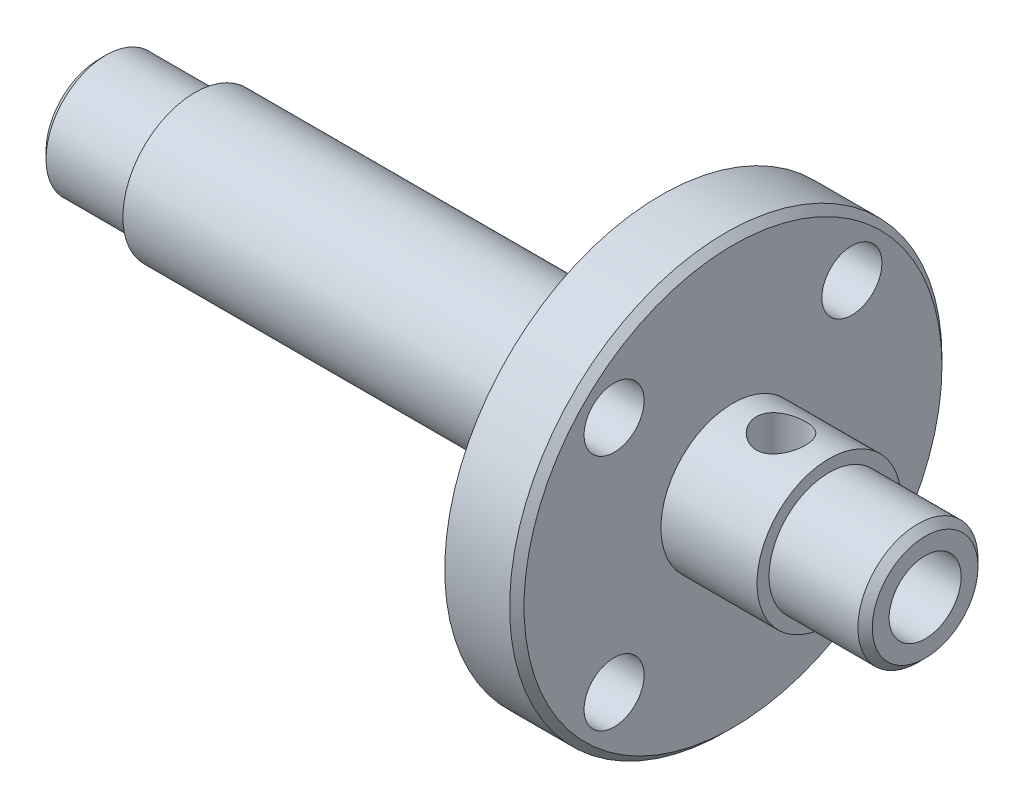
ISO-10303-21;
HEADER;
FILE_DESCRIPTION(('STEP AP214'),'2;1');
FILE_NAME('part.step','',(''),(''),'','','');
FILE_SCHEMA(('AUTOMOTIVE_DESIGN { 1 0 10303 214 1 1 1 1 }'));
ENDSEC;
DATA;
#1=APPLICATION_CONTEXT('core data for automotive mechanical design processes');
#2=APPLICATION_PROTOCOL_DEFINITION('international standard','automotive_design',2000,#1);
#3=PRODUCT_CONTEXT('',#1,'mechanical');
#4=PRODUCT('Part','Part','',(#3));
#5=PRODUCT_RELATED_PRODUCT_CATEGORY('part','',(#4));
#6=PRODUCT_DEFINITION_FORMATION('','',#4);
#7=PRODUCT_DEFINITION_CONTEXT('part definition',#1,'design');
#8=PRODUCT_DEFINITION('design','',#6,#7);
#9=PRODUCT_DEFINITION_SHAPE('','',#8);
#10=(LENGTH_UNIT() NAMED_UNIT(*) SI_UNIT(.MILLI.,.METRE.));
#11=(NAMED_UNIT(*) PLANE_ANGLE_UNIT() SI_UNIT($,.RADIAN.));
#12=(NAMED_UNIT(*) SI_UNIT($,.STERADIAN.) SOLID_ANGLE_UNIT());
#13=UNCERTAINTY_MEASURE_WITH_UNIT(LENGTH_MEASURE(1.E-05),#10,'distance_accuracy_value','');
#14=(GEOMETRIC_REPRESENTATION_CONTEXT(3) GLOBAL_UNCERTAINTY_ASSIGNED_CONTEXT((#13)) GLOBAL_UNIT_ASSIGNED_CONTEXT((#10,
#11,#12)) REPRESENTATION_CONTEXT('',''));
#15=CARTESIAN_POINT('',(0.,0.,0.));
#16=DIRECTION('',(0.,0.,1.));
#17=DIRECTION('',(1.,0.,0.));
#18=AXIS2_PLACEMENT_3D('',#15,#16,#17);
#19=CARTESIAN_POINT('',(0.,0.,0.));
#20=DIRECTION('',(-1.,0.,0.));
#21=DIRECTION('',(0.,0.,1.));
#22=AXIS2_PLACEMENT_3D('',#19,#20,#21);
#23=PLANE('',#22);
#24=CARTESIAN_POINT('',(0.,0.,0.));
#25=DIRECTION('',(-1.,0.,0.));
#26=DIRECTION('',(0.,0.,1.));
#27=AXIS2_PLACEMENT_3D('',#24,#25,#26);
#28=CIRCLE('',#27,2.19999999999999);
#29=CARTESIAN_POINT('',(0.,0.,2.19999999999999));
#30=VERTEX_POINT('',#29);
#31=EDGE_CURVE('E188',#30,#30,#28,.T.);
#32=ORIENTED_EDGE('',*,*,#31,.T.);
#33=EDGE_LOOP('',(#32));
#34=FACE_BOUND('',#33,.T.);
#35=ADVANCED_FACE('F38',(#34),#23,.T.);
#36=CARTESIAN_POINT('',(34.4,0.,0.));
#37=DIRECTION('',(1.,0.,0.));
#38=DIRECTION('',(0.,0.,-1.));
#39=AXIS2_PLACEMENT_3D('',#36,#37,#38);
#40=CYLINDRICAL_SURFACE('',#39,2.49999999999999);
#41=CARTESIAN_POINT('',(0.300000000000009,0.,0.));
#42=DIRECTION('',(-1.,0.,0.));
#43=DIRECTION('',(0.,0.,1.));
#44=AXIS2_PLACEMENT_3D('',#41,#42,#43);
#45=CIRCLE('',#44,2.49999999999999);
#46=CARTESIAN_POINT('',(0.300000000000009,0.,2.49999999999999));
#47=VERTEX_POINT('',#46);
#48=EDGE_CURVE('E191',#47,#47,#45,.F.);
#49=ORIENTED_EDGE('',*,*,#48,.T.);
#50=EDGE_LOOP('',(#49));
#51=FACE_BOUND('',#50,.T.);
#52=CARTESIAN_POINT('',(4.,0.,0.));
#53=DIRECTION('',(1.,0.,0.));
#54=DIRECTION('',(0.,0.,-1.));
#55=AXIS2_PLACEMENT_3D('',#52,#53,#54);
#56=CIRCLE('',#55,2.49999999999999);
#57=CARTESIAN_POINT('',(4.,0.,-2.49999999999999));
#58=VERTEX_POINT('',#57);
#59=EDGE_CURVE('E110',#58,#58,#56,.T.);
#60=ORIENTED_EDGE('',*,*,#59,.F.);
#61=EDGE_LOOP('',(#60));
#62=FACE_BOUND('',#61,.T.);
#63=ADVANCED_FACE('F165',(#51,#62),#40,.T.);
#64=CARTESIAN_POINT('',(4.,2.49999999999999,0.));
#65=DIRECTION('',(-1.,0.,0.));
#66=DIRECTION('',(0.,0.,1.));
#67=AXIS2_PLACEMENT_3D('',#64,#65,#66);
#68=PLANE('',#67);
#69=ORIENTED_EDGE('',*,*,#59,.T.);
#70=EDGE_LOOP('',(#69));
#71=FACE_BOUND('',#70,.T.);
#72=CARTESIAN_POINT('',(4.,0.,0.));
#73=DIRECTION('',(1.,0.,0.));
#74=DIRECTION('',(0.,0.,-1.));
#75=AXIS2_PLACEMENT_3D('',#72,#73,#74);
#76=CIRCLE('',#75,2.99999999999999);
#77=CARTESIAN_POINT('',(4.,0.,-2.99999999999999));
#78=VERTEX_POINT('',#77);
#79=EDGE_CURVE('E107',#78,#78,#76,.T.);
#80=ORIENTED_EDGE('',*,*,#79,.F.);
#81=EDGE_LOOP('',(#80));
#82=FACE_BOUND('',#81,.T.);
#83=ADVANCED_FACE('F171',(#71,#82),#68,.T.);
#84=CARTESIAN_POINT('',(34.4,0.,0.));
#85=DIRECTION('',(1.,0.,0.));
#86=DIRECTION('',(0.,0.,-1.));
#87=AXIS2_PLACEMENT_3D('',#84,#85,#86);
#88=CYLINDRICAL_SURFACE('',#87,3.);
#89=ORIENTED_EDGE('',*,*,#79,.T.);
#90=EDGE_LOOP('',(#89));
#91=FACE_BOUND('',#90,.T.);
#92=CARTESIAN_POINT('',(23.4,0.,0.));
#93=DIRECTION('',(1.,0.,0.));
#94=DIRECTION('',(0.,0.,-1.));
#95=AXIS2_PLACEMENT_3D('',#92,#93,#94);
#96=CIRCLE('',#95,3.);
#97=CARTESIAN_POINT('',(23.4,0.,-3.));
#98=VERTEX_POINT('',#97);
#99=EDGE_CURVE('E104',#98,#98,#96,.T.);
#100=ORIENTED_EDGE('',*,*,#99,.F.);
#101=EDGE_LOOP('',(#100));
#102=FACE_BOUND('',#101,.T.);
#103=ADVANCED_FACE('F234',(#91,#102),#88,.T.);
#104=CARTESIAN_POINT('',(23.4,3.,0.));
#105=DIRECTION('',(-1.,0.,0.));
#106=DIRECTION('',(0.,0.,1.));
#107=AXIS2_PLACEMENT_3D('',#104,#105,#106);
#108=PLANE('',#107);
#109=CARTESIAN_POINT('',(23.4,4.94974746830583,4.94974746830583));
#110=DIRECTION('',(-1.,0.,0.));
#111=DIRECTION('',(0.,0.,1.));
#112=AXIS2_PLACEMENT_3D('',#109,#110,#111);
#113=CIRCLE('',#112,1.25);
#114=CARTESIAN_POINT('',(23.4,4.94974746830583,6.19974746830583));
#115=VERTEX_POINT('',#114);
#116=EDGE_CURVE('E71',#115,#115,#113,.T.);
#117=ORIENTED_EDGE('',*,*,#116,.F.);
#118=EDGE_LOOP('',(#117));
#119=FACE_BOUND('',#118,.T.);
#120=CARTESIAN_POINT('',(23.4,4.94974746830583,-4.94974746830583));
#121=DIRECTION('',(-1.,0.,0.));
#122=DIRECTION('',(0.,0.,1.));
#123=AXIS2_PLACEMENT_3D('',#120,#121,#122);
#124=CIRCLE('',#123,1.25);
#125=CARTESIAN_POINT('',(23.4,4.94974746830583,-3.69974746830584));
#126=VERTEX_POINT('',#125);
#127=EDGE_CURVE('E77',#126,#126,#124,.T.);
#128=ORIENTED_EDGE('',*,*,#127,.F.);
#129=EDGE_LOOP('',(#128));
#130=FACE_BOUND('',#129,.T.);
#131=CARTESIAN_POINT('',(23.4,-4.94974746830583,-4.94974746830583));
#132=DIRECTION('',(-1.,0.,0.));
#133=DIRECTION('',(0.,0.,1.));
#134=AXIS2_PLACEMENT_3D('',#131,#132,#133);
#135=CIRCLE('',#134,1.25);
#136=CARTESIAN_POINT('',(23.4,-4.94974746830583,-3.69974746830583));
#137=VERTEX_POINT('',#136);
#138=EDGE_CURVE('E83',#137,#137,#135,.T.);
#139=ORIENTED_EDGE('',*,*,#138,.F.);
#140=EDGE_LOOP('',(#139));
#141=FACE_BOUND('',#140,.T.);
#142=CARTESIAN_POINT('',(23.4,-4.94974746830583,4.94974746830583));
#143=DIRECTION('',(-1.,0.,0.));
#144=DIRECTION('',(0.,0.,1.));
#145=AXIS2_PLACEMENT_3D('',#142,#143,#144);
#146=CIRCLE('',#145,1.25);
#147=CARTESIAN_POINT('',(23.4,-4.94974746830583,6.19974746830583));
#148=VERTEX_POINT('',#147);
#149=EDGE_CURVE('E89',#148,#148,#146,.T.);
#150=ORIENTED_EDGE('',*,*,#149,.F.);
#151=EDGE_LOOP('',(#150));
#152=FACE_BOUND('',#151,.T.);
#153=ORIENTED_EDGE('',*,*,#99,.T.);
#154=EDGE_LOOP('',(#153));
#155=FACE_BOUND('',#154,.T.);
#156=CARTESIAN_POINT('',(23.4,0.,0.));
#157=DIRECTION('',(1.,0.,0.));
#158=DIRECTION('',(0.,0.,-1.));
#159=AXIS2_PLACEMENT_3D('',#156,#157,#158);
#160=CIRCLE('',#159,9.);
#161=CARTESIAN_POINT('',(23.4,0.,-9.));
#162=VERTEX_POINT('',#161);
#163=EDGE_CURVE('E101',#162,#162,#160,.T.);
#164=ORIENTED_EDGE('',*,*,#163,.F.);
#165=EDGE_LOOP('',(#164));
#166=FACE_BOUND('',#165,.T.);
#167=ADVANCED_FACE('F229',(#119,#130,#141,#152,#155,#166),#108,.T.);
#168=CARTESIAN_POINT('',(34.4,0.,0.));
#169=DIRECTION('',(1.,0.,0.));
#170=DIRECTION('',(0.,0.,-1.));
#171=AXIS2_PLACEMENT_3D('',#168,#169,#170);
#172=CYLINDRICAL_SURFACE('',#171,9.);
#173=CARTESIAN_POINT('',(26.1,0.,0.));
#174=DIRECTION('',(1.,0.,0.));
#175=DIRECTION('',(0.,0.,-1.));
#176=AXIS2_PLACEMENT_3D('',#173,#174,#175);
#177=CIRCLE('',#176,9.);
#178=CARTESIAN_POINT('',(26.1,0.,-9.));
#179=VERTEX_POINT('',#178);
#180=EDGE_CURVE('E192',#179,#179,#177,.F.);
#181=ORIENTED_EDGE('',*,*,#180,.T.);
#182=EDGE_LOOP('',(#181));
#183=FACE_BOUND('',#182,.T.);
#184=ORIENTED_EDGE('',*,*,#163,.T.);
#185=EDGE_LOOP('',(#184));
#186=FACE_BOUND('',#185,.T.);
#187=ADVANCED_FACE('F209',(#183,#186),#172,.T.);
#188=CARTESIAN_POINT('',(26.4,9.,0.));
#189=DIRECTION('',(1.,0.,0.));
#190=DIRECTION('',(0.,0.,-1.));
#191=AXIS2_PLACEMENT_3D('',#188,#189,#190);
#192=PLANE('',#191);
#193=CARTESIAN_POINT('',(26.4,0.,0.));
#194=DIRECTION('',(1.,0.,0.));
#195=DIRECTION('',(0.,0.,-1.));
#196=AXIS2_PLACEMENT_3D('',#193,#194,#195);
#197=CIRCLE('',#196,8.69999999999999);
#198=CARTESIAN_POINT('',(26.4,0.,-8.69999999999999));
#199=VERTEX_POINT('',#198);
#200=EDGE_CURVE('E119',#199,#199,#197,.T.);
#201=ORIENTED_EDGE('',*,*,#200,.T.);
#202=EDGE_LOOP('',(#201));
#203=FACE_BOUND('',#202,.T.);
#204=CARTESIAN_POINT('',(26.4,4.94974746830583,4.94974746830583));
#205=DIRECTION('',(1.,0.,0.));
#206=DIRECTION('',(0.,0.,-1.));
#207=AXIS2_PLACEMENT_3D('',#204,#205,#206);
#208=CIRCLE('',#207,1.25);
#209=CARTESIAN_POINT('',(26.4,4.94974746830583,3.69974746830583));
#210=VERTEX_POINT('',#209);
#211=EDGE_CURVE('E65',#210,#210,#208,.T.);
#212=ORIENTED_EDGE('',*,*,#211,.F.);
#213=EDGE_LOOP('',(#212));
#214=FACE_BOUND('',#213,.T.);
#215=CARTESIAN_POINT('',(26.4,4.94974746830583,-4.94974746830583));
#216=DIRECTION('',(1.,0.,0.));
#217=DIRECTION('',(0.,0.,-1.));
#218=AXIS2_PLACEMENT_3D('',#215,#216,#217);
#219=CIRCLE('',#218,1.25);
#220=CARTESIAN_POINT('',(26.4,4.94974746830583,-6.19974746830583));
#221=VERTEX_POINT('',#220);
#222=EDGE_CURVE('E74',#221,#221,#219,.T.);
#223=ORIENTED_EDGE('',*,*,#222,.F.);
#224=EDGE_LOOP('',(#223));
#225=FACE_BOUND('',#224,.T.);
#226=CARTESIAN_POINT('',(26.4,-4.94974746830583,-4.94974746830583));
#227=DIRECTION('',(1.,0.,0.));
#228=DIRECTION('',(0.,0.,-1.));
#229=AXIS2_PLACEMENT_3D('',#226,#227,#228);
#230=CIRCLE('',#229,1.25);
#231=CARTESIAN_POINT('',(26.4,-4.94974746830583,-6.19974746830583));
#232=VERTEX_POINT('',#231);
#233=EDGE_CURVE('E80',#232,#232,#230,.T.);
#234=ORIENTED_EDGE('',*,*,#233,.F.);
#235=EDGE_LOOP('',(#234));
#236=FACE_BOUND('',#235,.T.);
#237=CARTESIAN_POINT('',(26.4,-4.94974746830583,4.94974746830583));
#238=DIRECTION('',(1.,0.,0.));
#239=DIRECTION('',(0.,0.,-1.));
#240=AXIS2_PLACEMENT_3D('',#237,#238,#239);
#241=CIRCLE('',#240,1.25);
#242=CARTESIAN_POINT('',(26.4,-4.94974746830583,3.69974746830583));
#243=VERTEX_POINT('',#242);
#244=EDGE_CURVE('E86',#243,#243,#241,.T.);
#245=ORIENTED_EDGE('',*,*,#244,.F.);
#246=EDGE_LOOP('',(#245));
#247=FACE_BOUND('',#246,.T.);
#248=CARTESIAN_POINT('',(26.4,0.,0.));
#249=DIRECTION('',(1.,0.,0.));
#250=DIRECTION('',(0.,0.,-1.));
#251=AXIS2_PLACEMENT_3D('',#248,#249,#250);
#252=CIRCLE('',#251,3.);
#253=CARTESIAN_POINT('',(26.4,0.,-3.));
#254=VERTEX_POINT('',#253);
#255=EDGE_CURVE('E98',#254,#254,#252,.T.);
#256=ORIENTED_EDGE('',*,*,#255,.F.);
#257=EDGE_LOOP('',(#256));
#258=FACE_BOUND('',#257,.T.);
#259=ADVANCED_FACE('F161',(#203,#214,#225,#236,#247,#258),#192,.T.);
#260=CARTESIAN_POINT('',(34.4,0.,0.));
#261=DIRECTION('',(1.,0.,0.));
#262=DIRECTION('',(0.,0.,-1.));
#263=AXIS2_PLACEMENT_3D('',#260,#261,#262);
#264=CYLINDRICAL_SURFACE('',#263,3.);
#265=CARTESIAN_POINT('',(28.4,2.81946360146749,1.02499999999999));
#266=CARTESIAN_POINT('',(28.4557398092487,2.81946314948273,1.02500056561831));
#267=CARTESIAN_POINT('',(28.5114757395352,2.82113458607686,1.02043794577451));
#268=CARTESIAN_POINT('',(28.6212906805516,2.82760275151599,1.00237359015758));
#269=CARTESIAN_POINT('',(28.6753694858541,2.83239986621125,0.988870750753104));
#270=CARTESIAN_POINT('',(28.7802604039504,2.84451395747483,0.953460182449129));
#271=CARTESIAN_POINT('',(28.8310789380518,2.85182578830797,0.931569606589712));
#272=CARTESIAN_POINT('',(28.928339450132,2.86813781666419,0.880064009035718));
#273=CARTESIAN_POINT('',(28.9747803843716,2.8771384153135,0.85044715149469));
#274=CARTESIAN_POINT('',(29.0638775894959,2.89622895849098,0.783024796160039));
#275=CARTESIAN_POINT('',(29.1063276899086,2.90634703561055,0.744954746470403));
#276=CARTESIAN_POINT('',(29.1843824476404,2.92629530840756,0.662270639184246));
#277=CARTESIAN_POINT('',(29.2199859418468,2.93612545493085,0.617655471958038));
#278=CARTESIAN_POINT('',(29.2842831942175,2.95471764789522,0.521628993283313));
#279=CARTESIAN_POINT('',(29.3127593876018,2.96344277469904,0.470064223873336));
#280=CARTESIAN_POINT('',(29.3605510894189,2.97850910542737,0.36252682711397));
#281=CARTESIAN_POINT('',(29.3798692000594,2.98485098642888,0.306555457147819));
#282=CARTESIAN_POINT('',(29.4080926774302,2.99423692225673,0.19395649004507));
#283=CARTESIAN_POINT('',(29.4173515649657,2.99739264439316,0.137426988079115));
#284=CARTESIAN_POINT('',(29.4263194945154,3.00044791701951,0.0235345033114803));
#285=CARTESIAN_POINT('',(29.4260311198609,3.00034834833741,-0.0338282498271425));
#286=CARTESIAN_POINT('',(29.4161334471173,2.99697904888511,-0.145250650634688));
#287=CARTESIAN_POINT('',(29.4069084722826,2.99384003376262,-0.199349045078396));
#288=CARTESIAN_POINT('',(29.3800370988115,2.98491006160941,-0.305177760578966));
#289=CARTESIAN_POINT('',(29.3623901225152,2.97911892267224,-0.356907918933192));
#290=CARTESIAN_POINT('',(29.3189603849029,2.96537261973141,-0.457352990468922));
#291=CARTESIAN_POINT('',(29.2930712195233,2.95738935262361,-0.506017892591441));
#292=CARTESIAN_POINT('',(29.2339808046853,2.94008542013754,-0.598423734106469));
#293=CARTESIAN_POINT('',(29.2007774514837,2.93076437024882,-0.642163251354145));
#294=CARTESIAN_POINT('',(29.1260803025243,2.91122089139187,-0.725759487993307));
#295=CARTESIAN_POINT('',(29.0842584515587,2.90097667928376,-0.765318416853983));
#296=CARTESIAN_POINT('',(28.9944914788045,2.88112513454282,-0.836960777222389));
#297=CARTESIAN_POINT('',(28.9465453133809,2.87151791088304,-0.869042931986792));
#298=CARTESIAN_POINT('',(28.8449035649021,2.85390525575956,-0.925261914734396));
#299=CARTESIAN_POINT('',(28.7911297667958,2.84592723630639,-0.949266583343231));
#300=CARTESIAN_POINT('',(28.6799612956538,2.83279297336624,-0.987776727747503));
#301=CARTESIAN_POINT('',(28.6225682452674,2.82763547522303,-1.00228642776794));
#302=CARTESIAN_POINT('',(28.508687198592,2.82101238315106,-1.02077499830013));
#303=CARTESIAN_POINT('',(28.4522839869444,2.81938427691891,-1.0252178683824));
#304=CARTESIAN_POINT('',(28.3395264142346,2.81954887295408,-1.02476577325974));
#305=CARTESIAN_POINT('',(28.2831720458277,2.82134091285065,-1.01987261613877));
#306=CARTESIAN_POINT('',(28.1742718540043,2.82798125851968,-1.00130511491288));
#307=CARTESIAN_POINT('',(28.1216621683034,2.83271490644205,-0.987959858037607));
#308=CARTESIAN_POINT('',(28.019441679419,2.84457706612572,-0.953265492357314));
#309=CARTESIAN_POINT('',(27.9698314265155,2.8517060157687,-0.93191492002921));
#310=CARTESIAN_POINT('',(27.8732073091101,2.86784573836058,-0.881018695978641));
#311=CARTESIAN_POINT('',(27.8263326465675,2.87691072664774,-0.851226441057623));
#312=CARTESIAN_POINT('',(27.7380806480428,2.89579873289588,-0.784568623904479));
#313=CARTESIAN_POINT('',(27.6967050175269,2.90562198453795,-0.747700875907282));
#314=CARTESIAN_POINT('',(27.6184448645414,2.9255250826349,-0.665709161218795));
#315=CARTESIAN_POINT('',(27.581896628852,2.93559249745695,-0.62026021543924));
#316=CARTESIAN_POINT('',(27.5169202482086,2.95435860744046,-0.523626134814986));
#317=CARTESIAN_POINT('',(27.4884918607406,2.96305734347651,-0.472441171350484));
#318=CARTESIAN_POINT('',(27.4408129299545,2.97807054353103,-0.36600953192689));
#319=CARTESIAN_POINT('',(27.4215065922577,2.98439945166683,-0.310789997904257));
#320=CARTESIAN_POINT('',(27.3925398326,2.9940210425188,-0.197627546721219));
#321=CARTESIAN_POINT('',(27.3828757319463,2.997314883133,-0.139685677023635));
#322=CARTESIAN_POINT('',(27.3738119067011,3.00040345328593,-0.0257917146771154));
#323=CARTESIAN_POINT('',(27.3739305073422,3.00036238660531,0.0301179943722282));
#324=CARTESIAN_POINT('',(27.3832307967987,2.99719461082008,0.141083824576459));
#325=CARTESIAN_POINT('',(27.3924116866397,2.99406817373634,0.196140020546467));
#326=CARTESIAN_POINT('',(27.4192519389145,2.98514426773312,0.302878353898031));
#327=CARTESIAN_POINT('',(27.4367610580297,2.97939420182934,0.354602520854906));
#328=CARTESIAN_POINT('',(27.4796198871659,2.96581569727817,0.454396401851573));
#329=CARTESIAN_POINT('',(27.5049710373602,2.95798687690907,0.502465442612926));
#330=CARTESIAN_POINT('',(27.5639034373064,2.94068200578516,0.595582219909352));
#331=CARTESIAN_POINT('',(27.5977613577368,2.93115457598385,0.640445169255912));
#332=CARTESIAN_POINT('',(27.6722824826467,2.91164148852872,0.724008622844157));
#333=CARTESIAN_POINT('',(27.7129479133503,2.90165568175219,0.762707103046256));
#334=CARTESIAN_POINT('',(27.8019556567709,2.88185276720998,0.834488102853542));
#335=CARTESIAN_POINT('',(27.8505474214237,2.87206006745076,0.867269064698303));
#336=CARTESIAN_POINT('',(27.9528576713437,2.85425649802235,0.924182467328671));
#337=CARTESIAN_POINT('',(28.0065751415875,2.84624527661615,0.948316615926579));
#338=CARTESIAN_POINT('',(28.1160913039179,2.83321579413605,0.986553431890955));
#339=CARTESIAN_POINT('',(28.1717876480121,2.82811903659588,1.00092138410055));
#340=CARTESIAN_POINT('',(28.284991185728,2.82124382696874,1.02014250236541));
#341=CARTESIAN_POINT('',(28.34249765694,2.81946406774433,1.02499941649641));
#342=CARTESIAN_POINT('',(28.4,2.81946360146749,1.02499999999999));
#343=B_SPLINE_CURVE_WITH_KNOTS('',3,(#265,#266,#267,#268,#269,#270,#271,#272,#273,#274,#275,
#276,#277,#278,#279,#280,#281,#282,#283,#284,#285,#286,#287,#288,#289,#290,#291,#292,#293,#294,
#295,#296,#297,#298,#299,#300,#301,#302,#303,#304,#305,#306,#307,#308,#309,#310,#311,#312,#313,
#314,#315,#316,#317,#318,#319,#320,#321,#322,#323,#324,#325,#326,#327,#328,#329,#330,#331,#332,
#333,#334,#335,#336,#337,#338,#339,#340,#341,#342),.UNSPECIFIED.,.T.,.F.,(4,2,2,2,2,2,2,2,2,2,2,
2,2,2,2,2,2,2,2,2,2,2,2,2,2,2,2,2,2,2,2,2,2,2,2,2,2,2,4),(0.,0.167006258588194,
0.334033137219551,0.500720250968166,0.667447007474323,0.840401632296516,1.01338561302385,
1.1911387809488,1.3688414111873,1.54007383757718,1.71125993168143,1.87539660800793,
2.0395445439872,2.20590391528944,2.37231119832926,2.54692358144216,2.72156575977281,
2.8989402562648,3.07623578671341,3.24517709972497,3.41408569763537,3.57679115294986,
3.73952636841431,3.90761785317396,4.07576134867349,4.25247286989662,4.42917911275648,
4.60479008661497,4.78033403597043,4.94724007751802,5.11413140515269,5.27811999430655,
5.4421387175377,5.61240405086441,5.7827251743281,5.96015022556374,6.13754021464043,
6.30989526883683,6.4821823882931),.UNSPECIFIED.);
#344=CARTESIAN_POINT('',(28.4,2.81946360146749,1.02499999999999));
#345=VERTEX_POINT('',#344);
#346=EDGE_CURVE('E113',#345,#345,#343,.T.);
#347=ORIENTED_EDGE('',*,*,#346,.F.);
#348=EDGE_LOOP('',(#347));
#349=FACE_BOUND('',#348,.T.);
#350=ORIENTED_EDGE('',*,*,#255,.T.);
#351=EDGE_LOOP('',(#350));
#352=FACE_BOUND('',#351,.T.);
#353=CARTESIAN_POINT('',(30.4,0.,0.));
#354=DIRECTION('',(1.,0.,0.));
#355=DIRECTION('',(0.,0.,-1.));
#356=AXIS2_PLACEMENT_3D('',#353,#354,#355);
#357=CIRCLE('',#356,3.);
#358=CARTESIAN_POINT('',(30.4,0.,-3.));
#359=VERTEX_POINT('',#358);
#360=EDGE_CURVE('E95',#359,#359,#357,.T.);
#361=ORIENTED_EDGE('',*,*,#360,.F.);
#362=EDGE_LOOP('',(#361));
#363=FACE_BOUND('',#362,.T.);
#364=ADVANCED_FACE('F121',(#349,#352,#363),#264,.T.);
#365=CARTESIAN_POINT('',(30.4,3.,0.));
#366=DIRECTION('',(1.,0.,0.));
#367=DIRECTION('',(0.,0.,-1.));
#368=AXIS2_PLACEMENT_3D('',#365,#366,#367);
#369=PLANE('',#368);
#370=ORIENTED_EDGE('',*,*,#360,.T.);
#371=EDGE_LOOP('',(#370));
#372=FACE_BOUND('',#371,.T.);
#373=CARTESIAN_POINT('',(30.4,0.,0.));
#374=DIRECTION('',(1.,0.,0.));
#375=DIRECTION('',(0.,0.,-1.));
#376=AXIS2_PLACEMENT_3D('',#373,#374,#375);
#377=CIRCLE('',#376,2.5);
#378=CARTESIAN_POINT('',(30.4,0.,-2.5));
#379=VERTEX_POINT('',#378);
#380=EDGE_CURVE('E92',#379,#379,#377,.T.);
#381=ORIENTED_EDGE('',*,*,#380,.F.);
#382=EDGE_LOOP('',(#381));
#383=FACE_BOUND('',#382,.T.);
#384=ADVANCED_FACE('F154',(#372,#383),#369,.T.);
#385=CARTESIAN_POINT('',(34.4,0.,0.));
#386=DIRECTION('',(1.,0.,0.));
#387=DIRECTION('',(0.,0.,-1.));
#388=AXIS2_PLACEMENT_3D('',#385,#386,#387);
#389=CYLINDRICAL_SURFACE('',#388,2.5);
#390=CARTESIAN_POINT('',(34.1,0.,0.));
#391=DIRECTION('',(1.,0.,0.));
#392=DIRECTION('',(0.,0.,-1.));
#393=AXIS2_PLACEMENT_3D('',#390,#391,#392);
#394=CIRCLE('',#393,2.5);
#395=CARTESIAN_POINT('',(34.1,0.,-2.5));
#396=VERTEX_POINT('',#395);
#397=EDGE_CURVE('E11',#396,#396,#394,.F.);
#398=ORIENTED_EDGE('',*,*,#397,.T.);
#399=EDGE_LOOP('',(#398));
#400=FACE_BOUND('',#399,.T.);
#401=ORIENTED_EDGE('',*,*,#380,.T.);
#402=EDGE_LOOP('',(#401));
#403=FACE_BOUND('',#402,.T.);
#404=ADVANCED_FACE('F151',(#400,#403),#389,.T.);
#405=CARTESIAN_POINT('',(34.4,2.5,0.));
#406=DIRECTION('',(1.,0.,0.));
#407=DIRECTION('',(0.,0.,-1.));
#408=AXIS2_PLACEMENT_3D('',#405,#406,#407);
#409=PLANE('',#408);
#410=CARTESIAN_POINT('',(34.4,0.,0.));
#411=DIRECTION('',(1.,0.,0.));
#412=DIRECTION('',(0.,0.,-1.));
#413=AXIS2_PLACEMENT_3D('',#410,#411,#412);
#414=CIRCLE('',#413,1.5);
#415=CARTESIAN_POINT('',(34.4,0.,-1.5));
#416=VERTEX_POINT('',#415);
#417=EDGE_CURVE('E62',#416,#416,#414,.T.);
#418=ORIENTED_EDGE('',*,*,#417,.F.);
#419=EDGE_LOOP('',(#418));
#420=FACE_BOUND('',#419,.T.);
#421=CARTESIAN_POINT('',(34.4,0.,0.));
#422=DIRECTION('',(1.,0.,0.));
#423=DIRECTION('',(0.,0.,-1.));
#424=AXIS2_PLACEMENT_3D('',#421,#422,#423);
#425=CIRCLE('',#424,2.19999999999999);
#426=CARTESIAN_POINT('',(34.4,0.,-2.19999999999999));
#427=VERTEX_POINT('',#426);
#428=EDGE_CURVE('E50',#427,#427,#425,.T.);
#429=ORIENTED_EDGE('',*,*,#428,.T.);
#430=EDGE_LOOP('',(#429));
#431=FACE_BOUND('',#430,.T.);
#432=ADVANCED_FACE('F147',(#420,#431),#409,.T.);
#433=CARTESIAN_POINT('',(26.4,-4.94974746830583,4.94974746830583));
#434=DIRECTION('',(1.,0.,0.));
#435=DIRECTION('',(0.,0.,-1.));
#436=AXIS2_PLACEMENT_3D('',#433,#434,#435);
#437=CYLINDRICAL_SURFACE('',#436,1.25);
#438=ORIENTED_EDGE('',*,*,#149,.T.);
#439=EDGE_LOOP('',(#438));
#440=FACE_BOUND('',#439,.T.);
#441=ORIENTED_EDGE('',*,*,#244,.T.);
#442=EDGE_LOOP('',(#441));
#443=FACE_BOUND('',#442,.T.);
#444=ADVANCED_FACE('F143',(#440,#443),#437,.F.);
#445=CARTESIAN_POINT('',(26.4,-4.94974746830583,-4.94974746830583));
#446=DIRECTION('',(1.,0.,0.));
#447=DIRECTION('',(0.,0.,-1.));
#448=AXIS2_PLACEMENT_3D('',#445,#446,#447);
#449=CYLINDRICAL_SURFACE('',#448,1.25);
#450=ORIENTED_EDGE('',*,*,#138,.T.);
#451=EDGE_LOOP('',(#450));
#452=FACE_BOUND('',#451,.T.);
#453=ORIENTED_EDGE('',*,*,#233,.T.);
#454=EDGE_LOOP('',(#453));
#455=FACE_BOUND('',#454,.T.);
#456=ADVANCED_FACE('F139',(#452,#455),#449,.F.);
#457=CARTESIAN_POINT('',(26.4,4.94974746830583,-4.94974746830583));
#458=DIRECTION('',(1.,0.,0.));
#459=DIRECTION('',(0.,0.,-1.));
#460=AXIS2_PLACEMENT_3D('',#457,#458,#459);
#461=CYLINDRICAL_SURFACE('',#460,1.25);
#462=ORIENTED_EDGE('',*,*,#127,.T.);
#463=EDGE_LOOP('',(#462));
#464=FACE_BOUND('',#463,.T.);
#465=ORIENTED_EDGE('',*,*,#222,.T.);
#466=EDGE_LOOP('',(#465));
#467=FACE_BOUND('',#466,.T.);
#468=ADVANCED_FACE('F135',(#464,#467),#461,.F.);
#469=CARTESIAN_POINT('',(26.4,4.94974746830583,4.94974746830583));
#470=DIRECTION('',(1.,0.,0.));
#471=DIRECTION('',(0.,0.,-1.));
#472=AXIS2_PLACEMENT_3D('',#469,#470,#471);
#473=CYLINDRICAL_SURFACE('',#472,1.25);
#474=ORIENTED_EDGE('',*,*,#116,.T.);
#475=EDGE_LOOP('',(#474));
#476=FACE_BOUND('',#475,.T.);
#477=ORIENTED_EDGE('',*,*,#211,.T.);
#478=EDGE_LOOP('',(#477));
#479=FACE_BOUND('',#478,.T.);
#480=ADVANCED_FACE('F130',(#476,#479),#473,.F.);
#481=CARTESIAN_POINT('',(28.4,3.,0.));
#482=DIRECTION('',(0.,1.,0.));
#483=DIRECTION('',(0.,0.,1.));
#484=AXIS2_PLACEMENT_3D('',#481,#482,#483);
#485=CYLINDRICAL_SURFACE('',#484,1.02499999999999);
#486=CARTESIAN_POINT('',(28.4,1.09515980569048,1.02499999999999));
#487=CARTESIAN_POINT('',(28.3503878108802,1.09516708243748,1.02499603119121));
#488=CARTESIAN_POINT('',(28.3007467579123,1.09859765249466,1.02136401668891));
#489=CARTESIAN_POINT('',(28.2032723029177,1.11162962693285,1.00715646317257));
#490=CARTESIAN_POINT('',(28.1554429916845,1.12124420620742,0.99656609850876));
#491=CARTESIAN_POINT('',(28.0633349718411,1.14488001682742,0.969313124593447));
#492=CARTESIAN_POINT('',(28.0190247250142,1.15885476562939,0.95271428410468));
#493=CARTESIAN_POINT('',(27.9339046526303,1.1895550449598,0.914093515701554));
#494=CARTESIAN_POINT('',(27.8930953144083,1.20628095751452,0.89207083442181));
#495=CARTESIAN_POINT('',(27.808755012337,1.24390249375493,0.839005470478371));
#496=CARTESIAN_POINT('',(27.7658869827589,1.26503063508055,0.80707389739866));
#497=CARTESIAN_POINT('',(27.68553103896,1.30716169183045,0.736890691319377));
#498=CARTESIAN_POINT('',(27.648049349309,1.32816443591364,0.698631854436272));
#499=CARTESIAN_POINT('',(27.5737364120621,1.37150983306862,0.609729413921718));
#500=CARTESIAN_POINT('',(27.5379107439951,1.39355378371546,0.558085162543699));
#501=CARTESIAN_POINT('',(27.4757944103874,1.43281301335623,0.447723366857432));
#502=CARTESIAN_POINT('',(27.4494857502577,1.45003739099084,0.389019453976404));
#503=CARTESIAN_POINT('',(27.4134324966136,1.47396117331425,0.282167589205082));
#504=CARTESIAN_POINT('',(27.4011636666798,1.48223054640506,0.235216520673384));
#505=CARTESIAN_POINT('',(27.3833740101047,1.49427552252262,0.139498880735747));
#506=CARTESIAN_POINT('',(27.3778479526931,1.49805460887249,0.0907337469120739));
#507=CARTESIAN_POINT('',(27.3738503030853,1.50078517271219,-0.00730729248686804));
#508=CARTESIAN_POINT('',(27.3753910084553,1.49972823456989,-0.0565839394561103));
#509=CARTESIAN_POINT('',(27.3854621876879,1.49286590563032,-0.154082415532112));
#510=CARTESIAN_POINT('',(27.3939946936768,1.48705913432247,-0.202303933787844));
#511=CARTESIAN_POINT('',(27.4173544736388,1.47135802432634,-0.295459709333191));
#512=CARTESIAN_POINT('',(27.4320573543122,1.46154456030662,-0.340439389660087));
#513=CARTESIAN_POINT('',(27.4670986560979,1.43857748417419,-0.427214261517569));
#514=CARTESIAN_POINT('',(27.4874381528288,1.42542323458948,-0.469008843302576));
#515=CARTESIAN_POINT('',(27.5356713879597,1.39500854740397,-0.553335208019093));
#516=CARTESIAN_POINT('',(27.5641580802761,1.3774524457448,-0.595419436756785));
#517=CARTESIAN_POINT('',(27.6265489621642,1.34051072970636,-0.674492444243744));
#518=CARTESIAN_POINT('',(27.6604593293508,1.3211230395641,-0.711475321959085));
#519=CARTESIAN_POINT('',(27.7393636975261,1.27848581276836,-0.785881834968026));
#520=CARTESIAN_POINT('',(27.7852613474921,1.2551432396916,-0.822297555716182));
#521=CARTESIAN_POINT('',(27.8831909475009,1.21019653560004,-0.887117488766861));
#522=CARTESIAN_POINT('',(27.935219888244,1.18859156044305,-0.91552560824921));
#523=CARTESIAN_POINT('',(28.0319364613096,1.15469192704243,-0.957726315545386));
#524=CARTESIAN_POINT('',(28.0754553849975,1.14140352343956,-0.97338619102164));
#525=CARTESIAN_POINT('',(28.1652188778524,1.11920375062755,-0.998834573563721));
#526=CARTESIAN_POINT('',(28.2114582451779,1.11028431371218,-1.0086339101169));
#527=CARTESIAN_POINT('',(28.3060382598796,1.09817855653767,-1.02180738545957));
#528=CARTESIAN_POINT('',(28.3543935422118,1.09504212782715,-1.02512562448821));
#529=CARTESIAN_POINT('',(28.4510699393919,1.09528429750623,-1.02486709512359));
#530=CARTESIAN_POINT('',(28.4993910559932,1.09866253293997,-1.0212907108551));
#531=CARTESIAN_POINT('',(28.5886319070075,1.11050697872749,-1.00838242282217));
#532=CARTESIAN_POINT('',(28.6297516616689,1.11832500656098,-0.999780323457651));
#533=CARTESIAN_POINT('',(28.7098770224686,1.1374895064367,-0.977920586068667));
#534=CARTESIAN_POINT('',(28.7488805878688,1.14883931572989,-0.964658543232757));
#535=CARTESIAN_POINT('',(28.8416106047517,1.17970241047783,-0.926894310715023));
#536=CARTESIAN_POINT('',(28.8939210197367,1.20057616240811,-0.900025076866197));
#537=CARTESIAN_POINT('',(28.9926603552397,1.24445125416152,-0.838319234719761));
#538=CARTESIAN_POINT('',(29.0390779717128,1.26745654095431,-0.803467662560248));
#539=CARTESIAN_POINT('',(29.1261501898034,1.31350214995638,-0.725797760926895));
#540=CARTESIAN_POINT('',(29.1667083445143,1.33653786192845,-0.682868199797967));
#541=CARTESIAN_POINT('',(29.2403094676421,1.38007882867981,-0.58992156271276));
#542=CARTESIAN_POINT('',(29.273364133231,1.40058799893098,-0.539915718311195));
#543=CARTESIAN_POINT('',(29.3257532970377,1.4338974427088,-0.442828681325975));
#544=CARTESIAN_POINT('',(29.3464730831522,1.44741780040342,-0.396744444928404));
#545=CARTESIAN_POINT('',(29.381094856745,1.47028988959006,-0.301096398893873));
#546=CARTESIAN_POINT('',(29.3950011806918,1.47964427219557,-0.251534825454379));
#547=CARTESIAN_POINT('',(29.4153017278879,1.49337065850729,-0.149940281668715));
#548=CARTESIAN_POINT('',(29.421658176287,1.49771760490058,-0.0978962278188345));
#549=CARTESIAN_POINT('',(29.4263131446998,1.5008964969628,0.00671799789570601));
#550=CARTESIAN_POINT('',(29.424613661562,1.4997298093134,0.0592880361593866));
#551=CARTESIAN_POINT('',(29.4137615066779,1.49233853222369,0.158760607457149));
#552=CARTESIAN_POINT('',(29.4052473639147,1.48654735749063,0.205768084541113));
#553=CARTESIAN_POINT('',(29.3820140920122,1.4709360480884,0.297513055938395));
#554=CARTESIAN_POINT('',(29.3672936873575,1.46111508522547,0.3422500815082));
#555=CARTESIAN_POINT('',(29.331439036032,1.43762352634702,0.430614155333007));
#556=CARTESIAN_POINT('',(29.3100325289536,1.42379175690545,0.474086668272762));
#557=CARTESIAN_POINT('',(29.2618452770992,1.39348546774166,0.556907532347522));
#558=CARTESIAN_POINT('',(29.2350632594076,1.37701032225624,0.596254903286871));
#559=CARTESIAN_POINT('',(29.1721521997156,1.33972058208692,0.67630714218456));
#560=CARTESIAN_POINT('',(29.1352153028788,1.31863126686711,0.716249027258255));
#561=CARTESIAN_POINT('',(29.0555941075327,1.2759497813527,0.789788556482032));
#562=CARTESIAN_POINT('',(29.0128971150309,1.25435659010391,0.823371783104566));
#563=CARTESIAN_POINT('',(28.9160143270936,1.2097674337989,0.887802102628381));
#564=CARTESIAN_POINT('',(28.8610558787998,1.18698303454348,0.91764808885942));
#565=CARTESIAN_POINT('',(28.7449829903301,1.14694033202442,0.967239607644049));
#566=CARTESIAN_POINT('',(28.6838954408994,1.12965916778575,0.987027134010735));
#567=CARTESIAN_POINT('',(28.5848228765166,1.11008999060671,1.00886646963227));
#568=CARTESIAN_POINT('',(28.5483375971464,1.10454997330848,1.01488884639824));
#569=CARTESIAN_POINT('',(28.474573286818,1.0970833437636,1.02295578450431));
#570=CARTESIAN_POINT('',(28.437294798785,1.09515433556671,1.02500298345885));
#571=CARTESIAN_POINT('',(28.4,1.09515980569048,1.02499999999999));
#572=B_SPLINE_CURVE_WITH_KNOTS('',3,(#486,#487,#488,#489,#490,#491,#492,#493,#494,#495,#496,
#497,#498,#499,#500,#501,#502,#503,#504,#505,#506,#507,#508,#509,#510,#511,#512,#513,#514,#515,
#516,#517,#518,#519,#520,#521,#522,#523,#524,#525,#526,#527,#528,#529,#530,#531,#532,#533,#534,
#535,#536,#537,#538,#539,#540,#541,#542,#543,#544,#545,#546,#547,#548,#549,#550,#551,#552,#553,
#554,#555,#556,#557,#558,#559,#560,#561,#562,#563,#564,#565,#566,#567,#568,#569,#570,#571),
.UNSPECIFIED.,.T.,.F.,(4,2,2,2,2,2,2,2,2,2,2,2,2,2,2,2,2,2,2,2,2,2,2,2,2,2,2,2,2,2,2,2,2,2,2,2,
2,2,2,2,2,2,4),(0.,0.148660353531193,0.297638478448103,0.445079734075586,0.592541480688977,
0.764347698637882,0.936350889876629,1.13507427897232,1.3334199368577,1.48046447832037,
1.62739487590242,1.77458105837526,1.9218100348374,2.06620358225635,2.21062470285877,
2.37131861821874,2.53219688621904,2.72060994147004,2.90893090384163,3.05277036545764,
3.19634320318963,3.34114898837479,3.48594670613108,3.61363952381924,3.74145336929349,
3.92766922244024,4.11423705915022,4.30359187713401,4.49264945159234,4.64891740066697,
4.80508576246233,4.96203224495526,5.118939826675,5.26265765045342,5.40640502562883,
5.55700379479965,5.70763826777838,5.88200760307289,6.05676768647556,6.25541030374006,
6.45321663767621,6.56504279382733,6.67679472557274),.UNSPECIFIED.);
#573=CARTESIAN_POINT('',(28.4,1.09515980569048,1.02499999999999));
#574=VERTEX_POINT('',#573);
#575=EDGE_CURVE('E42',#574,#574,#572,.T.);
#576=ORIENTED_EDGE('',*,*,#575,.T.);
#577=EDGE_LOOP('',(#576));
#578=FACE_BOUND('',#577,.T.);
#579=ORIENTED_EDGE('',*,*,#346,.T.);
#580=EDGE_LOOP('',(#579));
#581=FACE_BOUND('',#580,.T.);
#582=ADVANCED_FACE('F125',(#578,#581),#485,.F.);
#583=CARTESIAN_POINT('',(26.4,0.,0.));
#584=DIRECTION('',(-1.,0.,0.));
#585=DIRECTION('',(0.,0.,1.));
#586=AXIS2_PLACEMENT_3D('',#583,#584,#585);
#587=CONICAL_SURFACE('',#586,8.69999999999999,0.785398163397443);
#588=ORIENTED_EDGE('',*,*,#180,.F.);
#589=EDGE_LOOP('',(#588));
#590=FACE_BOUND('',#589,.T.);
#591=ORIENTED_EDGE('',*,*,#200,.F.);
#592=EDGE_LOOP('',(#591));
#593=FACE_BOUND('',#592,.T.);
#594=ADVANCED_FACE('F129',(#590,#593),#587,.T.);
#595=CARTESIAN_POINT('',(0.300000000000009,0.,0.));
#596=DIRECTION('',(1.,0.,0.));
#597=DIRECTION('',(0.,0.,-1.));
#598=AXIS2_PLACEMENT_3D('',#595,#596,#597);
#599=CONICAL_SURFACE('',#598,2.49999999999999,0.785398163397445);
#600=ORIENTED_EDGE('',*,*,#31,.F.);
#601=EDGE_LOOP('',(#600));
#602=FACE_BOUND('',#601,.T.);
#603=ORIENTED_EDGE('',*,*,#48,.F.);
#604=EDGE_LOOP('',(#603));
#605=FACE_BOUND('',#604,.T.);
#606=ADVANCED_FACE('F178',(#602,#605),#599,.T.);
#607=CARTESIAN_POINT('',(34.4,0.,0.));
#608=DIRECTION('',(-1.,0.,0.));
#609=DIRECTION('',(0.,0.,1.));
#610=AXIS2_PLACEMENT_3D('',#607,#608,#609);
#611=CONICAL_SURFACE('',#610,2.19999999999999,0.785398163397467);
#612=ORIENTED_EDGE('',*,*,#397,.F.);
#613=EDGE_LOOP('',(#612));
#614=FACE_BOUND('',#613,.T.);
#615=ORIENTED_EDGE('',*,*,#428,.F.);
#616=EDGE_LOOP('',(#615));
#617=FACE_BOUND('',#616,.T.);
#618=ADVANCED_FACE('F40',(#614,#617),#611,.T.);
#619=CARTESIAN_POINT('',(34.4,0.,0.));
#620=DIRECTION('',(1.,0.,0.));
#621=DIRECTION('',(0.,0.,-1.));
#622=AXIS2_PLACEMENT_3D('',#619,#620,#621);
#623=CYLINDRICAL_SURFACE('',#622,1.5);
#624=ORIENTED_EDGE('',*,*,#417,.T.);
#625=EDGE_LOOP('',(#624));
#626=FACE_BOUND('',#625,.T.);
#627=CARTESIAN_POINT('',(24.4,0.,0.));
#628=DIRECTION('',(1.,0.,0.));
#629=DIRECTION('',(0.,0.,-1.));
#630=AXIS2_PLACEMENT_3D('',#627,#628,#629);
#631=CIRCLE('',#630,1.5);
#632=CARTESIAN_POINT('',(24.4,0.,-1.5));
#633=VERTEX_POINT('',#632);
#634=EDGE_CURVE('E60',#633,#633,#631,.T.);
#635=ORIENTED_EDGE('',*,*,#634,.F.);
#636=EDGE_LOOP('',(#635));
#637=FACE_BOUND('',#636,.T.);
#638=ORIENTED_EDGE('',*,*,#575,.F.);
#639=EDGE_LOOP('',(#638));
#640=FACE_BOUND('',#639,.T.);
#641=ADVANCED_FACE('F56',(#626,#637,#640),#623,.F.);
#642=CARTESIAN_POINT('',(24.4,0.,0.));
#643=DIRECTION('',(1.,0.,0.));
#644=DIRECTION('',(0.,0.,-1.));
#645=AXIS2_PLACEMENT_3D('',#642,#643,#644);
#646=CONICAL_SURFACE('',#645,1.5,1.02974425867665);
#647=CARTESIAN_POINT('',(23.4987090714587,0.,0.));
#648=VERTEX_POINT('',#647);
#649=VERTEX_LOOP('',#648);
#650=FACE_BOUND('',#649,.T.);
#651=ORIENTED_EDGE('',*,*,#634,.T.);
#652=EDGE_LOOP('',(#651));
#653=FACE_BOUND('',#652,.T.);
#654=ADVANCED_FACE('F53',(#650,#653),#646,.F.);
#655=CLOSED_SHELL('',(#35,#63,#83,#103,#167,#187,#259,#364,#384,#404,#432,#444,#456,#468,#480,
#582,#594,#606,#618,#641,#654));
#656=MANIFOLD_SOLID_BREP('B2',#655);
#657=ADVANCED_BREP_SHAPE_REPRESENTATION('',(#18,#656),#14);
#658=SHAPE_DEFINITION_REPRESENTATION(#9,#657);
ENDSEC;
END-ISO-10303-21;
